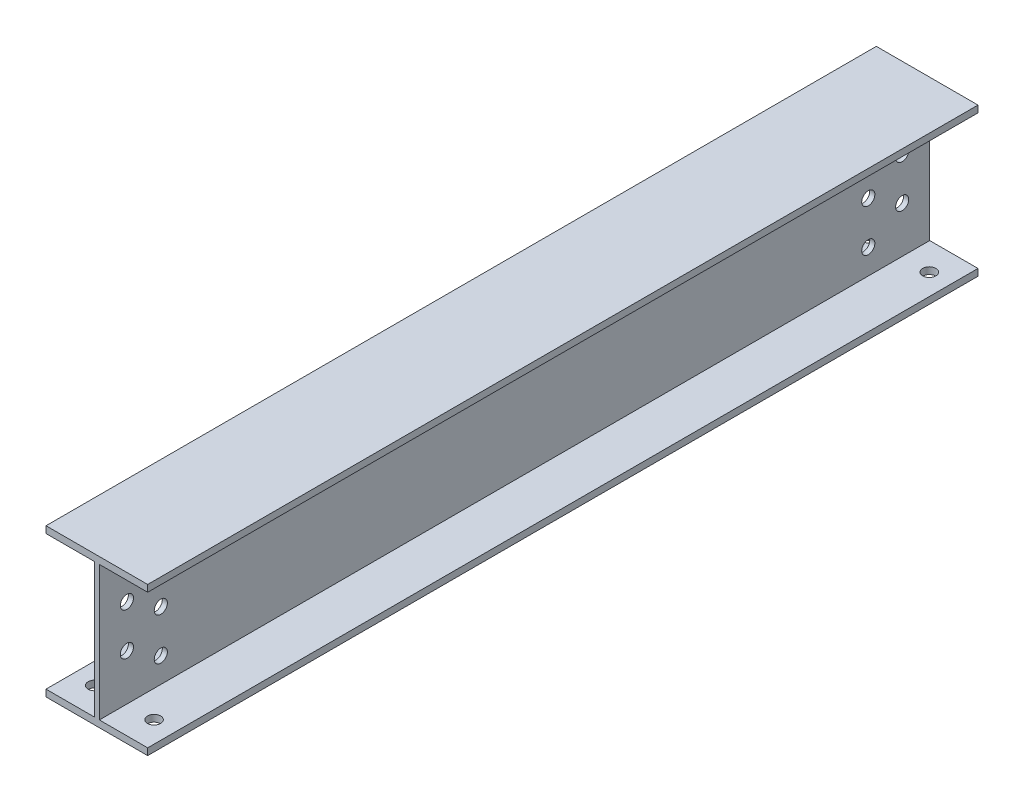
ISO-10303-21;
HEADER;
FILE_DESCRIPTION(('STEP AP214'),'2;1');
FILE_NAME('part.step','',(''),(''),'','','');
FILE_SCHEMA(('AUTOMOTIVE_DESIGN { 1 0 10303 214 1 1 1 1 }'));
ENDSEC;
DATA;
#1=APPLICATION_CONTEXT('core data for automotive mechanical design processes');
#2=APPLICATION_PROTOCOL_DEFINITION('international standard','automotive_design',2000,#1);
#3=PRODUCT_CONTEXT('',#1,'mechanical');
#4=PRODUCT('Part','Part','',(#3));
#5=PRODUCT_RELATED_PRODUCT_CATEGORY('part','',(#4));
#6=PRODUCT_DEFINITION_FORMATION('','',#4);
#7=PRODUCT_DEFINITION_CONTEXT('part definition',#1,'design');
#8=PRODUCT_DEFINITION('design','',#6,#7);
#9=PRODUCT_DEFINITION_SHAPE('','',#8);
#10=(LENGTH_UNIT() NAMED_UNIT(*) SI_UNIT(.MILLI.,.METRE.));
#11=(NAMED_UNIT(*) PLANE_ANGLE_UNIT() SI_UNIT($,.RADIAN.));
#12=(NAMED_UNIT(*) SI_UNIT($,.STERADIAN.) SOLID_ANGLE_UNIT());
#13=UNCERTAINTY_MEASURE_WITH_UNIT(LENGTH_MEASURE(1.E-05),#10,'distance_accuracy_value','');
#14=(GEOMETRIC_REPRESENTATION_CONTEXT(3) GLOBAL_UNCERTAINTY_ASSIGNED_CONTEXT((#13)) GLOBAL_UNIT_ASSIGNED_CONTEXT((#10,
#11,#12)) REPRESENTATION_CONTEXT('',''));
#15=CARTESIAN_POINT('',(0.,0.,0.));
#16=DIRECTION('',(0.,0.,1.));
#17=DIRECTION('',(1.,0.,0.));
#18=AXIS2_PLACEMENT_3D('',#15,#16,#17);
#19=CARTESIAN_POINT('',(-6.00000000000005,-159.,980.));
#20=DIRECTION('',(1.,0.,0.));
#21=DIRECTION('',(0.,1.,0.));
#22=AXIS2_PLACEMENT_3D('',#19,#20,#21);
#23=PLANE('',#22);
#24=CARTESIAN_POINT('',(-6.00000000000003,-100.,835.000000000002));
#25=DIRECTION('',(1.,0.,0.));
#26=DIRECTION('',(0.,1.,0.));
#27=AXIS2_PLACEMENT_3D('',#24,#25,#26);
#28=CIRCLE('',#27,15.5000000000002);
#29=CARTESIAN_POINT('',(-6.00000000000003,-84.4999999999999,835.000000000002));
#30=VERTEX_POINT('',#29);
#31=EDGE_CURVE('E234',#30,#30,#28,.T.);
#32=ORIENTED_EDGE('',*,*,#31,.T.);
#33=EDGE_LOOP('',(#32));
#34=FACE_BOUND('',#33,.T.);
#35=CARTESIAN_POINT('',(-6.00000000000002,50.,-915.));
#36=DIRECTION('',(1.,0.,0.));
#37=DIRECTION('',(0.,1.,0.));
#38=AXIS2_PLACEMENT_3D('',#35,#36,#37);
#39=CIRCLE('',#38,15.5000000000002);
#40=CARTESIAN_POINT('',(-6.00000000000002,65.5000000000001,-915.));
#41=VERTEX_POINT('',#40);
#42=EDGE_CURVE('E231',#41,#41,#39,.T.);
#43=ORIENTED_EDGE('',*,*,#42,.T.);
#44=EDGE_LOOP('',(#43));
#45=FACE_BOUND('',#44,.T.);
#46=CARTESIAN_POINT('',(-6.00000000000001,100.,-835.000000000002));
#47=DIRECTION('',(1.,0.,0.));
#48=DIRECTION('',(0.,1.,0.));
#49=AXIS2_PLACEMENT_3D('',#46,#47,#48);
#50=CIRCLE('',#49,15.5000000000002);
#51=CARTESIAN_POINT('',(-6.,115.5,-835.000000000002));
#52=VERTEX_POINT('',#51);
#53=EDGE_CURVE('E228',#52,#52,#50,.T.);
#54=ORIENTED_EDGE('',*,*,#53,.T.);
#55=EDGE_LOOP('',(#54));
#56=FACE_BOUND('',#55,.T.);
#57=CARTESIAN_POINT('',(-6.00000000000002,0.,-835.000000000002));
#58=DIRECTION('',(1.,0.,0.));
#59=DIRECTION('',(0.,1.,0.));
#60=AXIS2_PLACEMENT_3D('',#57,#58,#59);
#61=CIRCLE('',#60,15.5000000000002);
#62=CARTESIAN_POINT('',(-6.00000000000002,15.5000000000001,-835.000000000002));
#63=VERTEX_POINT('',#62);
#64=EDGE_CURVE('E224',#63,#63,#61,.T.);
#65=ORIENTED_EDGE('',*,*,#64,.T.);
#66=EDGE_LOOP('',(#65));
#67=FACE_BOUND('',#66,.T.);
#68=CARTESIAN_POINT('',(-6.00000000000003,-100.,-835.000000000002));
#69=DIRECTION('',(1.,0.,0.));
#70=DIRECTION('',(0.,1.,0.));
#71=AXIS2_PLACEMENT_3D('',#68,#69,#70);
#72=CIRCLE('',#71,15.5000000000002);
#73=CARTESIAN_POINT('',(-6.00000000000003,-84.4999999999999,-835.000000000002));
#74=VERTEX_POINT('',#73);
#75=EDGE_CURVE('E220',#74,#74,#72,.T.);
#76=ORIENTED_EDGE('',*,*,#75,.T.);
#77=EDGE_LOOP('',(#76));
#78=FACE_BOUND('',#77,.T.);
#79=CARTESIAN_POINT('',(-6.00000000000003,-50.,915.));
#80=DIRECTION('',(1.,0.,0.));
#81=DIRECTION('',(0.,1.,0.));
#82=AXIS2_PLACEMENT_3D('',#79,#80,#81);
#83=CIRCLE('',#82,15.5000000000002);
#84=CARTESIAN_POINT('',(-6.00000000000003,-34.4999999999999,915.));
#85=VERTEX_POINT('',#84);
#86=EDGE_CURVE('E216',#85,#85,#83,.T.);
#87=ORIENTED_EDGE('',*,*,#86,.T.);
#88=EDGE_LOOP('',(#87));
#89=FACE_BOUND('',#88,.T.);
#90=CARTESIAN_POINT('',(-6.00000000000002,0.,835.000000000002));
#91=DIRECTION('',(1.,0.,0.));
#92=DIRECTION('',(0.,1.,0.));
#93=AXIS2_PLACEMENT_3D('',#90,#91,#92);
#94=CIRCLE('',#93,15.5000000000002);
#95=CARTESIAN_POINT('',(-6.00000000000002,15.5000000000001,835.000000000002));
#96=VERTEX_POINT('',#95);
#97=EDGE_CURVE('E212',#96,#96,#94,.T.);
#98=ORIENTED_EDGE('',*,*,#97,.T.);
#99=EDGE_LOOP('',(#98));
#100=FACE_BOUND('',#99,.T.);
#101=CARTESIAN_POINT('',(-6.00000000000003,-50.,-915.));
#102=DIRECTION('',(1.,0.,0.));
#103=DIRECTION('',(0.,1.,0.));
#104=AXIS2_PLACEMENT_3D('',#101,#102,#103);
#105=CIRCLE('',#104,15.5000000000002);
#106=CARTESIAN_POINT('',(-6.00000000000003,-34.4999999999999,-915.));
#107=VERTEX_POINT('',#106);
#108=EDGE_CURVE('E208',#107,#107,#105,.T.);
#109=ORIENTED_EDGE('',*,*,#108,.T.);
#110=EDGE_LOOP('',(#109));
#111=FACE_BOUND('',#110,.T.);
#112=CARTESIAN_POINT('',(-6.00000000000001,100.,835.000000000002));
#113=DIRECTION('',(1.,0.,0.));
#114=DIRECTION('',(0.,1.,0.));
#115=AXIS2_PLACEMENT_3D('',#112,#113,#114);
#116=CIRCLE('',#115,15.5000000000002);
#117=CARTESIAN_POINT('',(-6.,115.5,835.000000000002));
#118=VERTEX_POINT('',#117);
#119=EDGE_CURVE('E204',#118,#118,#116,.T.);
#120=ORIENTED_EDGE('',*,*,#119,.T.);
#121=EDGE_LOOP('',(#120));
#122=FACE_BOUND('',#121,.T.);
#123=CARTESIAN_POINT('',(-6.00000000000002,50.,915.));
#124=DIRECTION('',(1.,0.,0.));
#125=DIRECTION('',(0.,1.,0.));
#126=AXIS2_PLACEMENT_3D('',#123,#124,#125);
#127=CIRCLE('',#126,15.5000000000002);
#128=CARTESIAN_POINT('',(-6.00000000000002,65.5000000000001,915.));
#129=VERTEX_POINT('',#128);
#130=EDGE_CURVE('E158',#129,#129,#127,.T.);
#131=ORIENTED_EDGE('',*,*,#130,.T.);
#132=EDGE_LOOP('',(#131));
#133=FACE_BOUND('',#132,.T.);
#134=DIRECTION('',(0.,-1.,0.));
#135=VECTOR('',#134,1.);
#136=CARTESIAN_POINT('',(-6.00000000000005,-159.,-980.));
#137=LINE('',#136,#135);
#138=CARTESIAN_POINT('',(-6.,159.,-980.));
#139=VERTEX_POINT('',#138);
#140=CARTESIAN_POINT('',(-6.00000000000005,-159.,-980.));
#141=VERTEX_POINT('',#140);
#142=EDGE_CURVE('E154',#139,#141,#137,.T.);
#143=ORIENTED_EDGE('',*,*,#142,.T.);
#144=DIRECTION('',(0.,0.,-1.));
#145=VECTOR('',#144,1.);
#146=CARTESIAN_POINT('',(-6.00000000000005,-159.,980.));
#147=LINE('',#146,#145);
#148=CARTESIAN_POINT('',(-6.00000000000005,-159.,980.));
#149=VERTEX_POINT('',#148);
#150=EDGE_CURVE('E11',#149,#141,#147,.T.);
#151=ORIENTED_EDGE('',*,*,#150,.F.);
#152=DIRECTION('',(0.,-1.,0.));
#153=VECTOR('',#152,1.);
#154=CARTESIAN_POINT('',(-6.00000000000005,-159.,980.));
#155=LINE('',#154,#153);
#156=CARTESIAN_POINT('',(-6.,159.,980.));
#157=VERTEX_POINT('',#156);
#158=EDGE_CURVE('E177',#157,#149,#155,.T.);
#159=ORIENTED_EDGE('',*,*,#158,.F.);
#160=DIRECTION('',(0.,0.,-1.));
#161=VECTOR('',#160,1.);
#162=CARTESIAN_POINT('',(-6.,159.,980.));
#163=LINE('',#162,#161);
#164=EDGE_CURVE('E150',#157,#139,#163,.T.);
#165=ORIENTED_EDGE('',*,*,#164,.T.);
#166=EDGE_LOOP('',(#143,#151,#159,#165));
#167=FACE_BOUND('',#166,.T.);
#168=ADVANCED_FACE('F32',(#34,#45,#56,#67,#78,#89,#100,#111,#122,#133,#167),#23,.F.);
#169=CARTESIAN_POINT('',(-120.,-159.,980.));
#170=DIRECTION('',(0.,-1.,0.));
#171=DIRECTION('',(0.,0.,-1.));
#172=AXIS2_PLACEMENT_3D('',#169,#170,#171);
#173=PLANE('',#172);
#174=CARTESIAN_POINT('',(-69.9999999999998,-159.,915.));
#175=DIRECTION('',(0.,1.,0.));
#176=DIRECTION('',(0.,0.,-1.));
#177=AXIS2_PLACEMENT_3D('',#174,#175,#176);
#178=CIRCLE('',#177,15.5);
#179=CARTESIAN_POINT('',(-69.9999999999998,-159.,899.5));
#180=VERTEX_POINT('',#179);
#181=EDGE_CURVE('E399',#180,#180,#178,.T.);
#182=ORIENTED_EDGE('',*,*,#181,.F.);
#183=EDGE_LOOP('',(#182));
#184=FACE_BOUND('',#183,.T.);
#185=CARTESIAN_POINT('',(-70.,-159.,-915.));
#186=DIRECTION('',(0.,1.,0.));
#187=DIRECTION('',(0.,0.,1.));
#188=AXIS2_PLACEMENT_3D('',#185,#186,#187);
#189=CIRCLE('',#188,15.5);
#190=CARTESIAN_POINT('',(-70.,-159.,-899.5));
#191=VERTEX_POINT('',#190);
#192=EDGE_CURVE('E246',#191,#191,#189,.T.);
#193=ORIENTED_EDGE('',*,*,#192,.F.);
#194=EDGE_LOOP('',(#193));
#195=FACE_BOUND('',#194,.T.);
#196=DIRECTION('',(-1.,0.,0.));
#197=VECTOR('',#196,1.);
#198=CARTESIAN_POINT('',(-120.,-159.,-980.));
#199=LINE('',#198,#197);
#200=CARTESIAN_POINT('',(-120.,-159.,-980.));
#201=VERTEX_POINT('',#200);
#202=EDGE_CURVE('E157',#141,#201,#199,.T.);
#203=ORIENTED_EDGE('',*,*,#202,.T.);
#204=DIRECTION('',(0.,0.,-1.));
#205=VECTOR('',#204,1.);
#206=CARTESIAN_POINT('',(-120.,-159.,980.));
#207=LINE('',#206,#205);
#208=CARTESIAN_POINT('',(-120.,-159.,980.));
#209=VERTEX_POINT('',#208);
#210=EDGE_CURVE('E41',#209,#201,#207,.T.);
#211=ORIENTED_EDGE('',*,*,#210,.F.);
#212=DIRECTION('',(-1.,0.,0.));
#213=VECTOR('',#212,1.);
#214=CARTESIAN_POINT('',(-120.,-159.,980.));
#215=LINE('',#214,#213);
#216=EDGE_CURVE('E105',#149,#209,#215,.T.);
#217=ORIENTED_EDGE('',*,*,#216,.F.);
#218=ORIENTED_EDGE('',*,*,#150,.T.);
#219=EDGE_LOOP('',(#203,#211,#217,#218));
#220=FACE_BOUND('',#219,.T.);
#221=ADVANCED_FACE('F306',(#184,#195,#220),#173,.F.);
#222=CARTESIAN_POINT('',(-120.,-175.,980.));
#223=DIRECTION('',(1.,0.,0.));
#224=DIRECTION('',(0.,0.,-1.));
#225=AXIS2_PLACEMENT_3D('',#222,#223,#224);
#226=PLANE('',#225);
#227=DIRECTION('',(0.,-1.,0.));
#228=VECTOR('',#227,1.);
#229=CARTESIAN_POINT('',(-120.,-175.,-980.));
#230=LINE('',#229,#228);
#231=CARTESIAN_POINT('',(-120.,-175.,-980.));
#232=VERTEX_POINT('',#231);
#233=EDGE_CURVE('E160',#201,#232,#230,.T.);
#234=ORIENTED_EDGE('',*,*,#233,.T.);
#235=DIRECTION('',(0.,0.,-1.));
#236=VECTOR('',#235,1.);
#237=CARTESIAN_POINT('',(-120.,-175.,980.));
#238=LINE('',#237,#236);
#239=CARTESIAN_POINT('',(-120.,-175.,980.));
#240=VERTEX_POINT('',#239);
#241=EDGE_CURVE('E196',#240,#232,#238,.T.);
#242=ORIENTED_EDGE('',*,*,#241,.F.);
#243=DIRECTION('',(0.,-1.,0.));
#244=VECTOR('',#243,1.);
#245=CARTESIAN_POINT('',(-120.,-175.,980.));
#246=LINE('',#245,#244);
#247=EDGE_CURVE('E267',#209,#240,#246,.T.);
#248=ORIENTED_EDGE('',*,*,#247,.F.);
#249=ORIENTED_EDGE('',*,*,#210,.T.);
#250=EDGE_LOOP('',(#234,#242,#248,#249));
#251=FACE_BOUND('',#250,.T.);
#252=ADVANCED_FACE('F310',(#251),#226,.F.);
#253=CARTESIAN_POINT('',(120.,-175.,980.));
#254=DIRECTION('',(0.,1.,0.));
#255=DIRECTION('',(-1.,0.,0.));
#256=AXIS2_PLACEMENT_3D('',#253,#254,#255);
#257=PLANE('',#256);
#258=CARTESIAN_POINT('',(-69.9999999999998,-175.,915.));
#259=DIRECTION('',(0.,1.,0.));
#260=DIRECTION('',(0.,0.,-1.));
#261=AXIS2_PLACEMENT_3D('',#258,#259,#260);
#262=CIRCLE('',#261,15.5);
#263=CARTESIAN_POINT('',(-69.9999999999998,-175.,899.5));
#264=VERTEX_POINT('',#263);
#265=EDGE_CURVE('E396',#264,#264,#262,.T.);
#266=ORIENTED_EDGE('',*,*,#265,.T.);
#267=EDGE_LOOP('',(#266));
#268=FACE_BOUND('',#267,.T.);
#269=CARTESIAN_POINT('',(70.0000000000002,-175.,915.));
#270=DIRECTION('',(0.,1.,0.));
#271=DIRECTION('',(0.,0.,-1.));
#272=AXIS2_PLACEMENT_3D('',#269,#270,#271);
#273=CIRCLE('',#272,15.5);
#274=CARTESIAN_POINT('',(70.0000000000002,-175.,899.5));
#275=VERTEX_POINT('',#274);
#276=EDGE_CURVE('E404',#275,#275,#273,.T.);
#277=ORIENTED_EDGE('',*,*,#276,.T.);
#278=EDGE_LOOP('',(#277));
#279=FACE_BOUND('',#278,.T.);
#280=CARTESIAN_POINT('',(70.,-175.,-915.));
#281=DIRECTION('',(0.,1.,0.));
#282=DIRECTION('',(0.,0.,1.));
#283=AXIS2_PLACEMENT_3D('',#280,#281,#282);
#284=CIRCLE('',#283,15.5);
#285=CARTESIAN_POINT('',(70.,-175.,-899.5));
#286=VERTEX_POINT('',#285);
#287=EDGE_CURVE('E410',#286,#286,#284,.T.);
#288=ORIENTED_EDGE('',*,*,#287,.T.);
#289=EDGE_LOOP('',(#288));
#290=FACE_BOUND('',#289,.T.);
#291=CARTESIAN_POINT('',(-70.,-175.,-915.));
#292=DIRECTION('',(0.,1.,0.));
#293=DIRECTION('',(0.,0.,1.));
#294=AXIS2_PLACEMENT_3D('',#291,#292,#293);
#295=CIRCLE('',#294,15.5);
#296=CARTESIAN_POINT('',(-70.,-175.,-899.5));
#297=VERTEX_POINT('',#296);
#298=EDGE_CURVE('E244',#297,#297,#295,.T.);
#299=ORIENTED_EDGE('',*,*,#298,.T.);
#300=EDGE_LOOP('',(#299));
#301=FACE_BOUND('',#300,.T.);
#302=DIRECTION('',(1.,0.,0.));
#303=VECTOR('',#302,1.);
#304=CARTESIAN_POINT('',(120.,-175.,-980.));
#305=LINE('',#304,#303);
#306=CARTESIAN_POINT('',(120.,-175.,-980.));
#307=VERTEX_POINT('',#306);
#308=EDGE_CURVE('E162',#232,#307,#305,.T.);
#309=ORIENTED_EDGE('',*,*,#308,.T.);
#310=DIRECTION('',(0.,0.,-1.));
#311=VECTOR('',#310,1.);
#312=CARTESIAN_POINT('',(120.,-175.,980.));
#313=LINE('',#312,#311);
#314=CARTESIAN_POINT('',(120.,-175.,980.));
#315=VERTEX_POINT('',#314);
#316=EDGE_CURVE('E193',#315,#307,#313,.T.);
#317=ORIENTED_EDGE('',*,*,#316,.F.);
#318=DIRECTION('',(1.,0.,0.));
#319=VECTOR('',#318,1.);
#320=CARTESIAN_POINT('',(120.,-175.,980.));
#321=LINE('',#320,#319);
#322=EDGE_CURVE('E269',#240,#315,#321,.T.);
#323=ORIENTED_EDGE('',*,*,#322,.F.);
#324=ORIENTED_EDGE('',*,*,#241,.T.);
#325=EDGE_LOOP('',(#309,#317,#323,#324));
#326=FACE_BOUND('',#325,.T.);
#327=ADVANCED_FACE('F429',(#268,#279,#290,#301,#326),#257,.F.);
#328=CARTESIAN_POINT('',(120.,-159.,980.));
#329=DIRECTION('',(-1.,0.,0.));
#330=DIRECTION('',(0.,0.,1.));
#331=AXIS2_PLACEMENT_3D('',#328,#329,#330);
#332=PLANE('',#331);
#333=DIRECTION('',(0.,1.,0.));
#334=VECTOR('',#333,1.);
#335=CARTESIAN_POINT('',(120.,-159.,-980.));
#336=LINE('',#335,#334);
#337=CARTESIAN_POINT('',(120.,-159.,-980.));
#338=VERTEX_POINT('',#337);
#339=EDGE_CURVE('E164',#307,#338,#336,.T.);
#340=ORIENTED_EDGE('',*,*,#339,.T.);
#341=DIRECTION('',(0.,0.,-1.));
#342=VECTOR('',#341,1.);
#343=CARTESIAN_POINT('',(120.,-159.,980.));
#344=LINE('',#343,#342);
#345=CARTESIAN_POINT('',(120.,-159.,980.));
#346=VERTEX_POINT('',#345);
#347=EDGE_CURVE('E190',#346,#338,#344,.T.);
#348=ORIENTED_EDGE('',*,*,#347,.F.);
#349=DIRECTION('',(0.,1.,0.));
#350=VECTOR('',#349,1.);
#351=CARTESIAN_POINT('',(120.,-159.,980.));
#352=LINE('',#351,#350);
#353=EDGE_CURVE('E271',#315,#346,#352,.T.);
#354=ORIENTED_EDGE('',*,*,#353,.F.);
#355=ORIENTED_EDGE('',*,*,#316,.T.);
#356=EDGE_LOOP('',(#340,#348,#354,#355));
#357=FACE_BOUND('',#356,.T.);
#358=ADVANCED_FACE('F433',(#357),#332,.F.);
#359=CARTESIAN_POINT('',(6.00000000000005,-159.,980.));
#360=DIRECTION('',(0.,-1.,0.));
#361=DIRECTION('',(1.,0.,0.));
#362=AXIS2_PLACEMENT_3D('',#359,#360,#361);
#363=PLANE('',#362);
#364=CARTESIAN_POINT('',(70.0000000000002,-159.,915.));
#365=DIRECTION('',(0.,1.,0.));
#366=DIRECTION('',(0.,0.,-1.));
#367=AXIS2_PLACEMENT_3D('',#364,#365,#366);
#368=CIRCLE('',#367,15.5);
#369=CARTESIAN_POINT('',(70.0000000000002,-159.,899.5));
#370=VERTEX_POINT('',#369);
#371=EDGE_CURVE('E401',#370,#370,#368,.T.);
#372=ORIENTED_EDGE('',*,*,#371,.F.);
#373=EDGE_LOOP('',(#372));
#374=FACE_BOUND('',#373,.T.);
#375=CARTESIAN_POINT('',(70.,-159.,-915.));
#376=DIRECTION('',(0.,1.,0.));
#377=DIRECTION('',(0.,0.,1.));
#378=AXIS2_PLACEMENT_3D('',#375,#376,#377);
#379=CIRCLE('',#378,15.5);
#380=CARTESIAN_POINT('',(70.,-159.,-899.5));
#381=VERTEX_POINT('',#380);
#382=EDGE_CURVE('E407',#381,#381,#379,.T.);
#383=ORIENTED_EDGE('',*,*,#382,.F.);
#384=EDGE_LOOP('',(#383));
#385=FACE_BOUND('',#384,.T.);
#386=DIRECTION('',(-1.,0.,0.));
#387=VECTOR('',#386,1.);
#388=CARTESIAN_POINT('',(6.00000000000005,-159.,-980.));
#389=LINE('',#388,#387);
#390=CARTESIAN_POINT('',(6.00000000000005,-159.,-980.));
#391=VERTEX_POINT('',#390);
#392=EDGE_CURVE('E166',#338,#391,#389,.T.);
#393=ORIENTED_EDGE('',*,*,#392,.T.);
#394=DIRECTION('',(0.,0.,-1.));
#395=VECTOR('',#394,1.);
#396=CARTESIAN_POINT('',(6.00000000000005,-159.,980.));
#397=LINE('',#396,#395);
#398=CARTESIAN_POINT('',(6.00000000000005,-159.,980.));
#399=VERTEX_POINT('',#398);
#400=EDGE_CURVE('E187',#399,#391,#397,.T.);
#401=ORIENTED_EDGE('',*,*,#400,.F.);
#402=DIRECTION('',(-1.,0.,0.));
#403=VECTOR('',#402,1.);
#404=CARTESIAN_POINT('',(6.00000000000005,-159.,980.));
#405=LINE('',#404,#403);
#406=EDGE_CURVE('E273',#346,#399,#405,.T.);
#407=ORIENTED_EDGE('',*,*,#406,.F.);
#408=ORIENTED_EDGE('',*,*,#347,.T.);
#409=EDGE_LOOP('',(#393,#401,#407,#408));
#410=FACE_BOUND('',#409,.T.);
#411=ADVANCED_FACE('F438',(#374,#385,#410),#363,.F.);
#412=CARTESIAN_POINT('',(6.,159.,980.));
#413=DIRECTION('',(-1.,0.,0.));
#414=DIRECTION('',(0.,-1.,0.));
#415=AXIS2_PLACEMENT_3D('',#412,#413,#414);
#416=PLANE('',#415);
#417=CARTESIAN_POINT('',(6.00000000000003,-100.,835.000000000002));
#418=DIRECTION('',(-1.,0.,0.));
#419=DIRECTION('',(0.,-1.,0.));
#420=AXIS2_PLACEMENT_3D('',#417,#418,#419);
#421=CIRCLE('',#420,15.5000000000002);
#422=CARTESIAN_POINT('',(6.00000000000004,-115.5,835.000000000002));
#423=VERTEX_POINT('',#422);
#424=EDGE_CURVE('E35',#423,#423,#421,.T.);
#425=ORIENTED_EDGE('',*,*,#424,.T.);
#426=EDGE_LOOP('',(#425));
#427=FACE_BOUND('',#426,.T.);
#428=CARTESIAN_POINT('',(6.00000000000003,50.,-915.));
#429=DIRECTION('',(-1.,0.,0.));
#430=DIRECTION('',(0.,-1.,0.));
#431=AXIS2_PLACEMENT_3D('',#428,#429,#430);
#432=CIRCLE('',#431,15.5000000000002);
#433=CARTESIAN_POINT('',(6.00000000000004,34.4999999999998,-915.));
#434=VERTEX_POINT('',#433);
#435=EDGE_CURVE('E232',#434,#434,#432,.T.);
#436=ORIENTED_EDGE('',*,*,#435,.T.);
#437=EDGE_LOOP('',(#436));
#438=FACE_BOUND('',#437,.T.);
#439=CARTESIAN_POINT('',(6.00000000000001,100.,-835.000000000002));
#440=DIRECTION('',(-1.,0.,0.));
#441=DIRECTION('',(0.,-1.,0.));
#442=AXIS2_PLACEMENT_3D('',#439,#440,#441);
#443=CIRCLE('',#442,15.5000000000002);
#444=CARTESIAN_POINT('',(6.00000000000001,84.4999999999998,-835.000000000002));
#445=VERTEX_POINT('',#444);
#446=EDGE_CURVE('E229',#445,#445,#443,.T.);
#447=ORIENTED_EDGE('',*,*,#446,.T.);
#448=EDGE_LOOP('',(#447));
#449=FACE_BOUND('',#448,.T.);
#450=CARTESIAN_POINT('',(6.00000000000003,0.,-835.000000000002));
#451=DIRECTION('',(-1.,0.,0.));
#452=DIRECTION('',(0.,-1.,0.));
#453=AXIS2_PLACEMENT_3D('',#450,#451,#452);
#454=CIRCLE('',#453,15.5000000000002);
#455=CARTESIAN_POINT('',(6.00000000000004,-15.5000000000002,-835.000000000002));
#456=VERTEX_POINT('',#455);
#457=EDGE_CURVE('E225',#456,#456,#454,.T.);
#458=ORIENTED_EDGE('',*,*,#457,.T.);
#459=EDGE_LOOP('',(#458));
#460=FACE_BOUND('',#459,.T.);
#461=CARTESIAN_POINT('',(6.00000000000003,-100.,-835.000000000002));
#462=DIRECTION('',(-1.,0.,0.));
#463=DIRECTION('',(0.,-1.,0.));
#464=AXIS2_PLACEMENT_3D('',#461,#462,#463);
#465=CIRCLE('',#464,15.5000000000002);
#466=CARTESIAN_POINT('',(6.00000000000004,-115.5,-835.000000000002));
#467=VERTEX_POINT('',#466);
#468=EDGE_CURVE('E221',#467,#467,#465,.T.);
#469=ORIENTED_EDGE('',*,*,#468,.T.);
#470=EDGE_LOOP('',(#469));
#471=FACE_BOUND('',#470,.T.);
#472=CARTESIAN_POINT('',(6.00000000000003,-50.,915.));
#473=DIRECTION('',(-1.,0.,0.));
#474=DIRECTION('',(0.,-1.,0.));
#475=AXIS2_PLACEMENT_3D('',#472,#473,#474);
#476=CIRCLE('',#475,15.5000000000002);
#477=CARTESIAN_POINT('',(6.00000000000004,-65.5000000000002,915.));
#478=VERTEX_POINT('',#477);
#479=EDGE_CURVE('E217',#478,#478,#476,.T.);
#480=ORIENTED_EDGE('',*,*,#479,.T.);
#481=EDGE_LOOP('',(#480));
#482=FACE_BOUND('',#481,.T.);
#483=CARTESIAN_POINT('',(6.00000000000003,0.,835.000000000002));
#484=DIRECTION('',(-1.,0.,0.));
#485=DIRECTION('',(0.,-1.,0.));
#486=AXIS2_PLACEMENT_3D('',#483,#484,#485);
#487=CIRCLE('',#486,15.5000000000002);
#488=CARTESIAN_POINT('',(6.00000000000004,-15.5000000000002,835.000000000002));
#489=VERTEX_POINT('',#488);
#490=EDGE_CURVE('E213',#489,#489,#487,.T.);
#491=ORIENTED_EDGE('',*,*,#490,.T.);
#492=EDGE_LOOP('',(#491));
#493=FACE_BOUND('',#492,.T.);
#494=CARTESIAN_POINT('',(6.00000000000003,-50.,-915.));
#495=DIRECTION('',(-1.,0.,0.));
#496=DIRECTION('',(0.,-1.,0.));
#497=AXIS2_PLACEMENT_3D('',#494,#495,#496);
#498=CIRCLE('',#497,15.5000000000002);
#499=CARTESIAN_POINT('',(6.00000000000004,-65.5000000000002,-915.));
#500=VERTEX_POINT('',#499);
#501=EDGE_CURVE('E209',#500,#500,#498,.T.);
#502=ORIENTED_EDGE('',*,*,#501,.T.);
#503=EDGE_LOOP('',(#502));
#504=FACE_BOUND('',#503,.T.);
#505=CARTESIAN_POINT('',(6.00000000000001,100.,835.000000000002));
#506=DIRECTION('',(-1.,0.,0.));
#507=DIRECTION('',(0.,-1.,0.));
#508=AXIS2_PLACEMENT_3D('',#505,#506,#507);
#509=CIRCLE('',#508,15.5000000000002);
#510=CARTESIAN_POINT('',(6.00000000000001,84.4999999999998,835.000000000002));
#511=VERTEX_POINT('',#510);
#512=EDGE_CURVE('E205',#511,#511,#509,.T.);
#513=ORIENTED_EDGE('',*,*,#512,.T.);
#514=EDGE_LOOP('',(#513));
#515=FACE_BOUND('',#514,.T.);
#516=CARTESIAN_POINT('',(6.00000000000003,50.,915.));
#517=DIRECTION('',(-1.,0.,0.));
#518=DIRECTION('',(0.,-1.,0.));
#519=AXIS2_PLACEMENT_3D('',#516,#517,#518);
#520=CIRCLE('',#519,15.5000000000002);
#521=CARTESIAN_POINT('',(6.00000000000004,34.4999999999998,915.));
#522=VERTEX_POINT('',#521);
#523=EDGE_CURVE('E201',#522,#522,#520,.T.);
#524=ORIENTED_EDGE('',*,*,#523,.T.);
#525=EDGE_LOOP('',(#524));
#526=FACE_BOUND('',#525,.T.);
#527=DIRECTION('',(0.,1.,0.));
#528=VECTOR('',#527,1.);
#529=CARTESIAN_POINT('',(6.,159.,-980.));
#530=LINE('',#529,#528);
#531=CARTESIAN_POINT('',(6.,159.,-980.));
#532=VERTEX_POINT('',#531);
#533=EDGE_CURVE('E168',#391,#532,#530,.T.);
#534=ORIENTED_EDGE('',*,*,#533,.T.);
#535=DIRECTION('',(0.,0.,-1.));
#536=VECTOR('',#535,1.);
#537=CARTESIAN_POINT('',(6.,159.,980.));
#538=LINE('',#537,#536);
#539=CARTESIAN_POINT('',(6.,159.,980.));
#540=VERTEX_POINT('',#539);
#541=EDGE_CURVE('E184',#540,#532,#538,.T.);
#542=ORIENTED_EDGE('',*,*,#541,.F.);
#543=DIRECTION('',(0.,1.,0.));
#544=VECTOR('',#543,1.);
#545=CARTESIAN_POINT('',(6.,159.,980.));
#546=LINE('',#545,#544);
#547=EDGE_CURVE('E275',#399,#540,#546,.T.);
#548=ORIENTED_EDGE('',*,*,#547,.F.);
#549=ORIENTED_EDGE('',*,*,#400,.T.);
#550=EDGE_LOOP('',(#534,#542,#548,#549));
#551=FACE_BOUND('',#550,.T.);
#552=ADVANCED_FACE('F441',(#427,#438,#449,#460,#471,#482,#493,#504,#515,#526,#551),#416,.F.);
#553=CARTESIAN_POINT('',(120.,159.,980.));
#554=DIRECTION('',(0.,1.,0.));
#555=DIRECTION('',(0.,0.,1.));
#556=AXIS2_PLACEMENT_3D('',#553,#554,#555);
#557=PLANE('',#556);
#558=DIRECTION('',(1.,0.,0.));
#559=VECTOR('',#558,1.);
#560=CARTESIAN_POINT('',(120.,159.,-980.));
#561=LINE('',#560,#559);
#562=CARTESIAN_POINT('',(120.,159.,-980.));
#563=VERTEX_POINT('',#562);
#564=EDGE_CURVE('E170',#532,#563,#561,.T.);
#565=ORIENTED_EDGE('',*,*,#564,.T.);
#566=DIRECTION('',(0.,0.,-1.));
#567=VECTOR('',#566,1.);
#568=CARTESIAN_POINT('',(120.,159.,980.));
#569=LINE('',#568,#567);
#570=CARTESIAN_POINT('',(120.,159.,980.));
#571=VERTEX_POINT('',#570);
#572=EDGE_CURVE('E181',#571,#563,#569,.T.);
#573=ORIENTED_EDGE('',*,*,#572,.F.);
#574=DIRECTION('',(1.,0.,0.));
#575=VECTOR('',#574,1.);
#576=CARTESIAN_POINT('',(120.,159.,980.));
#577=LINE('',#576,#575);
#578=EDGE_CURVE('E277',#540,#571,#577,.T.);
#579=ORIENTED_EDGE('',*,*,#578,.F.);
#580=ORIENTED_EDGE('',*,*,#541,.T.);
#581=EDGE_LOOP('',(#565,#573,#579,#580));
#582=FACE_BOUND('',#581,.T.);
#583=ADVANCED_FACE('F283',(#582),#557,.F.);
#584=CARTESIAN_POINT('',(120.,175.,980.));
#585=DIRECTION('',(-1.,0.,0.));
#586=DIRECTION('',(0.,0.,1.));
#587=AXIS2_PLACEMENT_3D('',#584,#585,#586);
#588=PLANE('',#587);
#589=DIRECTION('',(0.,1.,0.));
#590=VECTOR('',#589,1.);
#591=CARTESIAN_POINT('',(120.,175.,-980.));
#592=LINE('',#591,#590);
#593=CARTESIAN_POINT('',(120.,175.,-980.));
#594=VERTEX_POINT('',#593);
#595=EDGE_CURVE('E172',#563,#594,#592,.T.);
#596=ORIENTED_EDGE('',*,*,#595,.T.);
#597=DIRECTION('',(0.,0.,-1.));
#598=VECTOR('',#597,1.);
#599=CARTESIAN_POINT('',(120.,175.,980.));
#600=LINE('',#599,#598);
#601=CARTESIAN_POINT('',(120.,175.,980.));
#602=VERTEX_POINT('',#601);
#603=EDGE_CURVE('E145',#602,#594,#600,.T.);
#604=ORIENTED_EDGE('',*,*,#603,.F.);
#605=DIRECTION('',(0.,1.,0.));
#606=VECTOR('',#605,1.);
#607=CARTESIAN_POINT('',(120.,175.,980.));
#608=LINE('',#607,#606);
#609=EDGE_CURVE('E136',#571,#602,#608,.T.);
#610=ORIENTED_EDGE('',*,*,#609,.F.);
#611=ORIENTED_EDGE('',*,*,#572,.T.);
#612=EDGE_LOOP('',(#596,#604,#610,#611));
#613=FACE_BOUND('',#612,.T.);
#614=ADVANCED_FACE('F287',(#613),#588,.F.);
#615=CARTESIAN_POINT('',(-120.,175.,980.));
#616=DIRECTION('',(0.,-1.,0.));
#617=DIRECTION('',(0.,0.,-1.));
#618=AXIS2_PLACEMENT_3D('',#615,#616,#617);
#619=PLANE('',#618);
#620=DIRECTION('',(-1.,0.,0.));
#621=VECTOR('',#620,1.);
#622=CARTESIAN_POINT('',(-120.,175.,-980.));
#623=LINE('',#622,#621);
#624=CARTESIAN_POINT('',(-120.,175.,-980.));
#625=VERTEX_POINT('',#624);
#626=EDGE_CURVE('E144',#594,#625,#623,.T.);
#627=ORIENTED_EDGE('',*,*,#626,.T.);
#628=DIRECTION('',(0.,0.,-1.));
#629=VECTOR('',#628,1.);
#630=CARTESIAN_POINT('',(-120.,175.,980.));
#631=LINE('',#630,#629);
#632=CARTESIAN_POINT('',(-120.,175.,980.));
#633=VERTEX_POINT('',#632);
#634=EDGE_CURVE('E141',#633,#625,#631,.T.);
#635=ORIENTED_EDGE('',*,*,#634,.F.);
#636=DIRECTION('',(-1.,0.,0.));
#637=VECTOR('',#636,1.);
#638=CARTESIAN_POINT('',(-120.,175.,980.));
#639=LINE('',#638,#637);
#640=EDGE_CURVE('E130',#602,#633,#639,.T.);
#641=ORIENTED_EDGE('',*,*,#640,.F.);
#642=ORIENTED_EDGE('',*,*,#603,.T.);
#643=EDGE_LOOP('',(#627,#635,#641,#642));
#644=FACE_BOUND('',#643,.T.);
#645=ADVANCED_FACE('F142',(#644),#619,.F.);
#646=CARTESIAN_POINT('',(-120.,159.,980.));
#647=DIRECTION('',(1.,0.,0.));
#648=DIRECTION('',(0.,0.,-1.));
#649=AXIS2_PLACEMENT_3D('',#646,#647,#648);
#650=PLANE('',#649);
#651=DIRECTION('',(0.,-1.,0.));
#652=VECTOR('',#651,1.);
#653=CARTESIAN_POINT('',(-120.,159.,-980.));
#654=LINE('',#653,#652);
#655=CARTESIAN_POINT('',(-120.,159.,-980.));
#656=VERTEX_POINT('',#655);
#657=EDGE_CURVE('E91',#625,#656,#654,.T.);
#658=ORIENTED_EDGE('',*,*,#657,.T.);
#659=DIRECTION('',(0.,0.,-1.));
#660=VECTOR('',#659,1.);
#661=CARTESIAN_POINT('',(-120.,159.,980.));
#662=LINE('',#661,#660);
#663=CARTESIAN_POINT('',(-120.,159.,980.));
#664=VERTEX_POINT('',#663);
#665=EDGE_CURVE('E146',#664,#656,#662,.T.);
#666=ORIENTED_EDGE('',*,*,#665,.F.);
#667=DIRECTION('',(0.,-1.,0.));
#668=VECTOR('',#667,1.);
#669=CARTESIAN_POINT('',(-120.,159.,980.));
#670=LINE('',#669,#668);
#671=EDGE_CURVE('E134',#633,#664,#670,.T.);
#672=ORIENTED_EDGE('',*,*,#671,.F.);
#673=ORIENTED_EDGE('',*,*,#634,.T.);
#674=EDGE_LOOP('',(#658,#666,#672,#673));
#675=FACE_BOUND('',#674,.T.);
#676=ADVANCED_FACE('F148',(#675),#650,.F.);
#677=CARTESIAN_POINT('',(-6.,159.,980.));
#678=DIRECTION('',(0.,1.,0.));
#679=DIRECTION('',(0.,0.,1.));
#680=AXIS2_PLACEMENT_3D('',#677,#678,#679);
#681=PLANE('',#680);
#682=DIRECTION('',(1.,0.,0.));
#683=VECTOR('',#682,1.);
#684=CARTESIAN_POINT('',(-6.,159.,-980.));
#685=LINE('',#684,#683);
#686=EDGE_CURVE('E97',#656,#139,#685,.T.);
#687=ORIENTED_EDGE('',*,*,#686,.T.);
#688=ORIENTED_EDGE('',*,*,#164,.F.);
#689=DIRECTION('',(1.,0.,0.));
#690=VECTOR('',#689,1.);
#691=CARTESIAN_POINT('',(-6.,159.,980.));
#692=LINE('',#691,#690);
#693=EDGE_CURVE('E50',#664,#157,#692,.T.);
#694=ORIENTED_EDGE('',*,*,#693,.F.);
#695=ORIENTED_EDGE('',*,*,#665,.T.);
#696=EDGE_LOOP('',(#687,#688,#694,#695));
#697=FACE_BOUND('',#696,.T.);
#698=ADVANCED_FACE('F295',(#697),#681,.F.);
#699=CARTESIAN_POINT('',(-6.,159.,980.));
#700=DIRECTION('',(0.,0.,1.));
#701=DIRECTION('',(1.,0.,0.));
#702=AXIS2_PLACEMENT_3D('',#699,#700,#701);
#703=PLANE('',#702);
#704=ORIENTED_EDGE('',*,*,#158,.T.);
#705=ORIENTED_EDGE('',*,*,#216,.T.);
#706=ORIENTED_EDGE('',*,*,#247,.T.);
#707=ORIENTED_EDGE('',*,*,#322,.T.);
#708=ORIENTED_EDGE('',*,*,#353,.T.);
#709=ORIENTED_EDGE('',*,*,#406,.T.);
#710=ORIENTED_EDGE('',*,*,#547,.T.);
#711=ORIENTED_EDGE('',*,*,#578,.T.);
#712=ORIENTED_EDGE('',*,*,#609,.T.);
#713=ORIENTED_EDGE('',*,*,#640,.T.);
#714=ORIENTED_EDGE('',*,*,#671,.T.);
#715=ORIENTED_EDGE('',*,*,#693,.T.);
#716=EDGE_LOOP('',(#704,#705,#706,#707,#708,#709,#710,#711,#712,#713,#714,#715));
#717=FACE_BOUND('',#716,.T.);
#718=ADVANCED_FACE('F132',(#717),#703,.T.);
#719=CARTESIAN_POINT('',(-6.,159.,-980.));
#720=DIRECTION('',(0.,0.,1.));
#721=DIRECTION('',(1.,0.,0.));
#722=AXIS2_PLACEMENT_3D('',#719,#720,#721);
#723=PLANE('',#722);
#724=ORIENTED_EDGE('',*,*,#142,.F.);
#725=ORIENTED_EDGE('',*,*,#686,.F.);
#726=ORIENTED_EDGE('',*,*,#657,.F.);
#727=ORIENTED_EDGE('',*,*,#626,.F.);
#728=ORIENTED_EDGE('',*,*,#595,.F.);
#729=ORIENTED_EDGE('',*,*,#564,.F.);
#730=ORIENTED_EDGE('',*,*,#533,.F.);
#731=ORIENTED_EDGE('',*,*,#392,.F.);
#732=ORIENTED_EDGE('',*,*,#339,.F.);
#733=ORIENTED_EDGE('',*,*,#308,.F.);
#734=ORIENTED_EDGE('',*,*,#233,.F.);
#735=ORIENTED_EDGE('',*,*,#202,.F.);
#736=EDGE_LOOP('',(#724,#725,#726,#727,#728,#729,#730,#731,#732,#733,#734,#735));
#737=FACE_BOUND('',#736,.T.);
#738=ADVANCED_FACE('F290',(#737),#723,.F.);
#739=CARTESIAN_POINT('',(-120.,50.,915.));
#740=DIRECTION('',(1.,0.,0.));
#741=DIRECTION('',(0.,0.,-1.));
#742=AXIS2_PLACEMENT_3D('',#739,#740,#741);
#743=CYLINDRICAL_SURFACE('',#742,15.5000000000002);
#744=ORIENTED_EDGE('',*,*,#523,.F.);
#745=EDGE_LOOP('',(#744));
#746=FACE_BOUND('',#745,.T.);
#747=ORIENTED_EDGE('',*,*,#130,.F.);
#748=EDGE_LOOP('',(#747));
#749=FACE_BOUND('',#748,.T.);
#750=ADVANCED_FACE('F331',(#746,#749),#743,.F.);
#751=CARTESIAN_POINT('',(-120.,100.,835.000000000002));
#752=DIRECTION('',(1.,0.,0.));
#753=DIRECTION('',(0.,0.,-1.));
#754=AXIS2_PLACEMENT_3D('',#751,#752,#753);
#755=CYLINDRICAL_SURFACE('',#754,15.5000000000002);
#756=ORIENTED_EDGE('',*,*,#512,.F.);
#757=EDGE_LOOP('',(#756));
#758=FACE_BOUND('',#757,.T.);
#759=ORIENTED_EDGE('',*,*,#119,.F.);
#760=EDGE_LOOP('',(#759));
#761=FACE_BOUND('',#760,.T.);
#762=ADVANCED_FACE('F333',(#758,#761),#755,.F.);
#763=CARTESIAN_POINT('',(-120.,-50.,-915.));
#764=DIRECTION('',(1.,0.,0.));
#765=DIRECTION('',(0.,0.,-1.));
#766=AXIS2_PLACEMENT_3D('',#763,#764,#765);
#767=CYLINDRICAL_SURFACE('',#766,15.5000000000002);
#768=ORIENTED_EDGE('',*,*,#501,.F.);
#769=EDGE_LOOP('',(#768));
#770=FACE_BOUND('',#769,.T.);
#771=ORIENTED_EDGE('',*,*,#108,.F.);
#772=EDGE_LOOP('',(#771));
#773=FACE_BOUND('',#772,.T.);
#774=ADVANCED_FACE('F340',(#770,#773),#767,.F.);
#775=CARTESIAN_POINT('',(-120.,0.,835.000000000002));
#776=DIRECTION('',(1.,0.,0.));
#777=DIRECTION('',(0.,0.,-1.));
#778=AXIS2_PLACEMENT_3D('',#775,#776,#777);
#779=CYLINDRICAL_SURFACE('',#778,15.5000000000002);
#780=ORIENTED_EDGE('',*,*,#490,.F.);
#781=EDGE_LOOP('',(#780));
#782=FACE_BOUND('',#781,.T.);
#783=ORIENTED_EDGE('',*,*,#97,.F.);
#784=EDGE_LOOP('',(#783));
#785=FACE_BOUND('',#784,.T.);
#786=ADVANCED_FACE('F347',(#782,#785),#779,.F.);
#787=CARTESIAN_POINT('',(-120.,-50.,915.));
#788=DIRECTION('',(1.,0.,0.));
#789=DIRECTION('',(0.,0.,-1.));
#790=AXIS2_PLACEMENT_3D('',#787,#788,#789);
#791=CYLINDRICAL_SURFACE('',#790,15.5000000000002);
#792=ORIENTED_EDGE('',*,*,#479,.F.);
#793=EDGE_LOOP('',(#792));
#794=FACE_BOUND('',#793,.T.);
#795=ORIENTED_EDGE('',*,*,#86,.F.);
#796=EDGE_LOOP('',(#795));
#797=FACE_BOUND('',#796,.T.);
#798=ADVANCED_FACE('F351',(#794,#797),#791,.F.);
#799=CARTESIAN_POINT('',(-120.,-100.,-835.000000000002));
#800=DIRECTION('',(1.,0.,0.));
#801=DIRECTION('',(0.,0.,-1.));
#802=AXIS2_PLACEMENT_3D('',#799,#800,#801);
#803=CYLINDRICAL_SURFACE('',#802,15.5000000000002);
#804=ORIENTED_EDGE('',*,*,#468,.F.);
#805=EDGE_LOOP('',(#804));
#806=FACE_BOUND('',#805,.T.);
#807=ORIENTED_EDGE('',*,*,#75,.F.);
#808=EDGE_LOOP('',(#807));
#809=FACE_BOUND('',#808,.T.);
#810=ADVANCED_FACE('F355',(#806,#809),#803,.F.);
#811=CARTESIAN_POINT('',(-120.,0.,-835.000000000002));
#812=DIRECTION('',(1.,0.,0.));
#813=DIRECTION('',(0.,0.,-1.));
#814=AXIS2_PLACEMENT_3D('',#811,#812,#813);
#815=CYLINDRICAL_SURFACE('',#814,15.5000000000002);
#816=ORIENTED_EDGE('',*,*,#457,.F.);
#817=EDGE_LOOP('',(#816));
#818=FACE_BOUND('',#817,.T.);
#819=ORIENTED_EDGE('',*,*,#64,.F.);
#820=EDGE_LOOP('',(#819));
#821=FACE_BOUND('',#820,.T.);
#822=ADVANCED_FACE('F359',(#818,#821),#815,.F.);
#823=CARTESIAN_POINT('',(-120.,100.,-835.000000000002));
#824=DIRECTION('',(1.,0.,0.));
#825=DIRECTION('',(0.,0.,-1.));
#826=AXIS2_PLACEMENT_3D('',#823,#824,#825);
#827=CYLINDRICAL_SURFACE('',#826,15.5000000000002);
#828=ORIENTED_EDGE('',*,*,#446,.F.);
#829=EDGE_LOOP('',(#828));
#830=FACE_BOUND('',#829,.T.);
#831=ORIENTED_EDGE('',*,*,#53,.F.);
#832=EDGE_LOOP('',(#831));
#833=FACE_BOUND('',#832,.T.);
#834=ADVANCED_FACE('F363',(#830,#833),#827,.F.);
#835=CARTESIAN_POINT('',(-120.,50.,-915.));
#836=DIRECTION('',(1.,0.,0.));
#837=DIRECTION('',(0.,0.,-1.));
#838=AXIS2_PLACEMENT_3D('',#835,#836,#837);
#839=CYLINDRICAL_SURFACE('',#838,15.5000000000002);
#840=ORIENTED_EDGE('',*,*,#435,.F.);
#841=EDGE_LOOP('',(#840));
#842=FACE_BOUND('',#841,.T.);
#843=ORIENTED_EDGE('',*,*,#42,.F.);
#844=EDGE_LOOP('',(#843));
#845=FACE_BOUND('',#844,.T.);
#846=ADVANCED_FACE('F367',(#842,#845),#839,.F.);
#847=CARTESIAN_POINT('',(-120.,-100.,835.000000000002));
#848=DIRECTION('',(1.,0.,0.));
#849=DIRECTION('',(0.,0.,-1.));
#850=AXIS2_PLACEMENT_3D('',#847,#848,#849);
#851=CYLINDRICAL_SURFACE('',#850,15.5000000000002);
#852=ORIENTED_EDGE('',*,*,#424,.F.);
#853=EDGE_LOOP('',(#852));
#854=FACE_BOUND('',#853,.T.);
#855=ORIENTED_EDGE('',*,*,#31,.F.);
#856=EDGE_LOOP('',(#855));
#857=FACE_BOUND('',#856,.T.);
#858=ADVANCED_FACE('F371',(#854,#857),#851,.F.);
#859=CARTESIAN_POINT('',(-70.,-175.,-915.));
#860=DIRECTION('',(0.,1.,0.));
#861=DIRECTION('',(0.,0.,1.));
#862=AXIS2_PLACEMENT_3D('',#859,#860,#861);
#863=CYLINDRICAL_SURFACE('',#862,15.5);
#864=ORIENTED_EDGE('',*,*,#298,.F.);
#865=EDGE_LOOP('',(#864));
#866=FACE_BOUND('',#865,.T.);
#867=ORIENTED_EDGE('',*,*,#192,.T.);
#868=EDGE_LOOP('',(#867));
#869=FACE_BOUND('',#868,.T.);
#870=ADVANCED_FACE('F375',(#866,#869),#863,.F.);
#871=CARTESIAN_POINT('',(70.,-175.,-915.));
#872=DIRECTION('',(0.,1.,0.));
#873=DIRECTION('',(0.,0.,1.));
#874=AXIS2_PLACEMENT_3D('',#871,#872,#873);
#875=CYLINDRICAL_SURFACE('',#874,15.5);
#876=ORIENTED_EDGE('',*,*,#287,.F.);
#877=EDGE_LOOP('',(#876));
#878=FACE_BOUND('',#877,.T.);
#879=ORIENTED_EDGE('',*,*,#382,.T.);
#880=EDGE_LOOP('',(#879));
#881=FACE_BOUND('',#880,.T.);
#882=ADVANCED_FACE('F379',(#878,#881),#875,.F.);
#883=CARTESIAN_POINT('',(70.0000000000002,-175.,915.));
#884=DIRECTION('',(0.,1.,0.));
#885=DIRECTION('',(0.,0.,1.));
#886=AXIS2_PLACEMENT_3D('',#883,#884,#885);
#887=CYLINDRICAL_SURFACE('',#886,15.5);
#888=ORIENTED_EDGE('',*,*,#276,.F.);
#889=EDGE_LOOP('',(#888));
#890=FACE_BOUND('',#889,.T.);
#891=ORIENTED_EDGE('',*,*,#371,.T.);
#892=EDGE_LOOP('',(#891));
#893=FACE_BOUND('',#892,.T.);
#894=ADVANCED_FACE('F383',(#890,#893),#887,.F.);
#895=CARTESIAN_POINT('',(-69.9999999999998,-175.,915.));
#896=DIRECTION('',(0.,1.,0.));
#897=DIRECTION('',(0.,0.,1.));
#898=AXIS2_PLACEMENT_3D('',#895,#896,#897);
#899=CYLINDRICAL_SURFACE('',#898,15.5);
#900=ORIENTED_EDGE('',*,*,#265,.F.);
#901=EDGE_LOOP('',(#900));
#902=FACE_BOUND('',#901,.T.);
#903=ORIENTED_EDGE('',*,*,#181,.T.);
#904=EDGE_LOOP('',(#903));
#905=FACE_BOUND('',#904,.T.);
#906=ADVANCED_FACE('F387',(#902,#905),#899,.F.);
#907=CLOSED_SHELL('',(#168,#221,#252,#327,#358,#411,#552,#583,#614,#645,#676,#698,#718,#738,
#750,#762,#774,#786,#798,#810,#822,#834,#846,#858,#870,#882,#894,#906));
#908=MANIFOLD_SOLID_BREP('B2',#907);
#909=ADVANCED_BREP_SHAPE_REPRESENTATION('',(#18,#908),#14);
#910=SHAPE_DEFINITION_REPRESENTATION(#9,#909);
ENDSEC;
END-ISO-10303-21;
